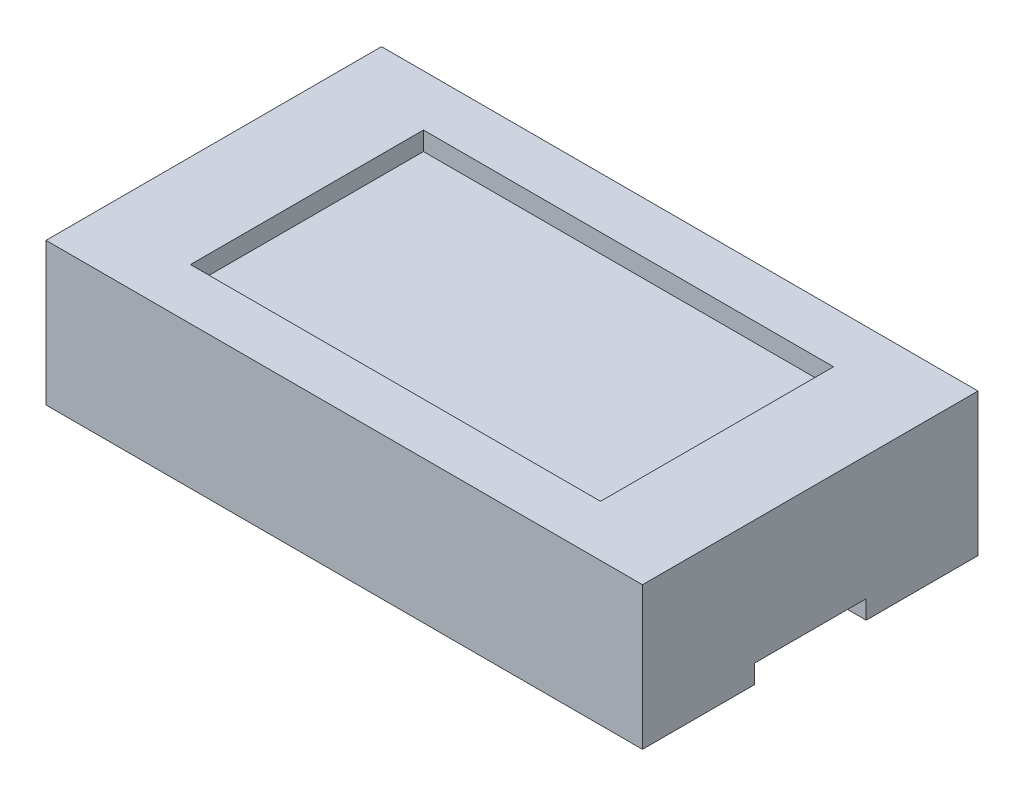
ISO-10303-21;
HEADER;
FILE_DESCRIPTION(('STEP AP214'),'2;1');
FILE_NAME('part.step','',(''),(''),'','','');
FILE_SCHEMA(('AUTOMOTIVE_DESIGN { 1 0 10303 214 1 1 1 1 }'));
ENDSEC;
DATA;
#1=APPLICATION_CONTEXT('core data for automotive mechanical design processes');
#2=APPLICATION_PROTOCOL_DEFINITION('international standard','automotive_design',2000,#1);
#3=PRODUCT_CONTEXT('',#1,'mechanical');
#4=PRODUCT('Part','Part','',(#3));
#5=PRODUCT_RELATED_PRODUCT_CATEGORY('part','',(#4));
#6=PRODUCT_DEFINITION_FORMATION('','',#4);
#7=PRODUCT_DEFINITION_CONTEXT('part definition',#1,'design');
#8=PRODUCT_DEFINITION('design','',#6,#7);
#9=PRODUCT_DEFINITION_SHAPE('','',#8);
#10=(LENGTH_UNIT() NAMED_UNIT(*) SI_UNIT(.MILLI.,.METRE.));
#11=(NAMED_UNIT(*) PLANE_ANGLE_UNIT() SI_UNIT($,.RADIAN.));
#12=(NAMED_UNIT(*) SI_UNIT($,.STERADIAN.) SOLID_ANGLE_UNIT());
#13=UNCERTAINTY_MEASURE_WITH_UNIT(LENGTH_MEASURE(1.E-05),#10,'distance_accuracy_value','');
#14=(GEOMETRIC_REPRESENTATION_CONTEXT(3) GLOBAL_UNCERTAINTY_ASSIGNED_CONTEXT((#13)) GLOBAL_UNIT_ASSIGNED_CONTEXT((#10,
#11,#12)) REPRESENTATION_CONTEXT('',''));
#15=CARTESIAN_POINT('',(0.,0.,0.));
#16=DIRECTION('',(0.,0.,1.));
#17=DIRECTION('',(1.,0.,0.));
#18=AXIS2_PLACEMENT_3D('',#15,#16,#17);
#19=CARTESIAN_POINT('',(32.,15.3,18.));
#20=DIRECTION('',(-1.,0.,0.));
#21=DIRECTION('',(0.,0.,1.));
#22=AXIS2_PLACEMENT_3D('',#19,#20,#21);
#23=PLANE('',#22);
#24=DIRECTION('',(0.,-1.,0.));
#25=VECTOR('',#24,1.);
#26=CARTESIAN_POINT('',(32.,2.,-6.00000000000001));
#27=LINE('',#26,#25);
#28=CARTESIAN_POINT('',(32.,2.,-6.00000000000001));
#29=VERTEX_POINT('',#28);
#30=CARTESIAN_POINT('',(32.,0.,-6.00000000000001));
#31=VERTEX_POINT('',#30);
#32=EDGE_CURVE('E134',#29,#31,#27,.T.);
#33=ORIENTED_EDGE('',*,*,#32,.T.);
#34=DIRECTION('',(0.,0.,-1.));
#35=VECTOR('',#34,1.);
#36=CARTESIAN_POINT('',(32.,0.,18.));
#37=LINE('',#36,#35);
#38=CARTESIAN_POINT('',(32.,0.,-18.));
#39=VERTEX_POINT('',#38);
#40=EDGE_CURVE('E216',#31,#39,#37,.T.);
#41=ORIENTED_EDGE('',*,*,#40,.T.);
#42=DIRECTION('',(0.,-1.,0.));
#43=VECTOR('',#42,1.);
#44=CARTESIAN_POINT('',(32.,15.3,-18.));
#45=LINE('',#44,#43);
#46=CARTESIAN_POINT('',(32.,15.3,-18.));
#47=VERTEX_POINT('',#46);
#48=EDGE_CURVE('E11',#47,#39,#45,.T.);
#49=ORIENTED_EDGE('',*,*,#48,.F.);
#50=DIRECTION('',(0.,0.,-1.));
#51=VECTOR('',#50,1.);
#52=CARTESIAN_POINT('',(32.,15.3,18.));
#53=LINE('',#52,#51);
#54=CARTESIAN_POINT('',(32.,15.3,18.));
#55=VERTEX_POINT('',#54);
#56=EDGE_CURVE('E225',#55,#47,#53,.T.);
#57=ORIENTED_EDGE('',*,*,#56,.F.);
#58=DIRECTION('',(0.,-1.,0.));
#59=VECTOR('',#58,1.);
#60=CARTESIAN_POINT('',(32.,15.3,18.));
#61=LINE('',#60,#59);
#62=CARTESIAN_POINT('',(32.,0.,18.));
#63=VERTEX_POINT('',#62);
#64=EDGE_CURVE('E239',#55,#63,#61,.T.);
#65=ORIENTED_EDGE('',*,*,#64,.T.);
#66=CARTESIAN_POINT('',(32.,0.,6.));
#67=VERTEX_POINT('',#66);
#68=EDGE_CURVE('E240',#63,#67,#37,.T.);
#69=ORIENTED_EDGE('',*,*,#68,.T.);
#70=DIRECTION('',(0.,-1.,0.));
#71=VECTOR('',#70,1.);
#72=CARTESIAN_POINT('',(32.,2.,6.));
#73=LINE('',#72,#71);
#74=CARTESIAN_POINT('',(32.,2.,6.));
#75=VERTEX_POINT('',#74);
#76=EDGE_CURVE('E60',#75,#67,#73,.T.);
#77=ORIENTED_EDGE('',*,*,#76,.F.);
#78=DIRECTION('',(0.,0.,1.));
#79=VECTOR('',#78,1.);
#80=CARTESIAN_POINT('',(32.,2.,0.));
#81=LINE('',#80,#79);
#82=EDGE_CURVE('E152',#29,#75,#81,.T.);
#83=ORIENTED_EDGE('',*,*,#82,.F.);
#84=EDGE_LOOP('',(#33,#41,#49,#57,#65,#69,#77,#83));
#85=FACE_BOUND('',#84,.T.);
#86=ADVANCED_FACE('F45',(#85),#23,.F.);
#87=CARTESIAN_POINT('',(0.,0.,0.));
#88=DIRECTION('',(0.,-1.,0.));
#89=DIRECTION('',(0.,0.,-1.));
#90=AXIS2_PLACEMENT_3D('',#87,#88,#89);
#91=PLANE('',#90);
#92=ORIENTED_EDGE('',*,*,#40,.F.);
#93=DIRECTION('',(-1.,0.,0.));
#94=VECTOR('',#93,1.);
#95=CARTESIAN_POINT('',(0.,0.,-6.));
#96=LINE('',#95,#94);
#97=CARTESIAN_POINT('',(16.,0.,-6.));
#98=VERTEX_POINT('',#97);
#99=EDGE_CURVE('E140',#31,#98,#96,.T.);
#100=ORIENTED_EDGE('',*,*,#99,.T.);
#101=DIRECTION('',(0.,0.,-1.));
#102=VECTOR('',#101,1.);
#103=CARTESIAN_POINT('',(16.,0.,0.));
#104=LINE('',#103,#102);
#105=CARTESIAN_POINT('',(16.,0.,6.));
#106=VERTEX_POINT('',#105);
#107=EDGE_CURVE('E155',#106,#98,#104,.T.);
#108=ORIENTED_EDGE('',*,*,#107,.F.);
#109=DIRECTION('',(-1.,0.,0.));
#110=VECTOR('',#109,1.);
#111=CARTESIAN_POINT('',(0.,0.,6.));
#112=LINE('',#111,#110);
#113=EDGE_CURVE('E168',#67,#106,#112,.T.);
#114=ORIENTED_EDGE('',*,*,#113,.F.);
#115=ORIENTED_EDGE('',*,*,#68,.F.);
#116=DIRECTION('',(1.,0.,0.));
#117=VECTOR('',#116,1.);
#118=CARTESIAN_POINT('',(-32.,0.,18.));
#119=LINE('',#118,#117);
#120=CARTESIAN_POINT('',(-32.,0.,18.));
#121=VERTEX_POINT('',#120);
#122=EDGE_CURVE('E230',#121,#63,#119,.T.);
#123=ORIENTED_EDGE('',*,*,#122,.F.);
#124=DIRECTION('',(0.,0.,1.));
#125=VECTOR('',#124,1.);
#126=CARTESIAN_POINT('',(-32.,0.,18.));
#127=LINE('',#126,#125);
#128=CARTESIAN_POINT('',(-32.,0.,-18.));
#129=VERTEX_POINT('',#128);
#130=EDGE_CURVE('E246',#129,#121,#127,.T.);
#131=ORIENTED_EDGE('',*,*,#130,.F.);
#132=DIRECTION('',(-1.,0.,0.));
#133=VECTOR('',#132,1.);
#134=CARTESIAN_POINT('',(-32.,0.,-18.));
#135=LINE('',#134,#133);
#136=EDGE_CURVE('E243',#39,#129,#135,.T.);
#137=ORIENTED_EDGE('',*,*,#136,.F.);
#138=EDGE_LOOP('',(#92,#100,#108,#114,#115,#123,#131,#137));
#139=FACE_BOUND('',#138,.T.);
#140=ADVANCED_FACE('F269',(#139),#91,.T.);
#141=CARTESIAN_POINT('',(-32.,15.3,-18.));
#142=DIRECTION('',(0.,0.,1.));
#143=DIRECTION('',(1.,0.,0.));
#144=AXIS2_PLACEMENT_3D('',#141,#142,#143);
#145=PLANE('',#144);
#146=ORIENTED_EDGE('',*,*,#136,.T.);
#147=DIRECTION('',(0.,-1.,0.));
#148=VECTOR('',#147,1.);
#149=CARTESIAN_POINT('',(-32.,15.3,-18.));
#150=LINE('',#149,#148);
#151=CARTESIAN_POINT('',(-32.,15.3,-18.));
#152=VERTEX_POINT('',#151);
#153=EDGE_CURVE('E53',#152,#129,#150,.T.);
#154=ORIENTED_EDGE('',*,*,#153,.F.);
#155=DIRECTION('',(-1.,0.,0.));
#156=VECTOR('',#155,1.);
#157=CARTESIAN_POINT('',(-32.,15.3,-18.));
#158=LINE('',#157,#156);
#159=EDGE_CURVE('E229',#47,#152,#158,.T.);
#160=ORIENTED_EDGE('',*,*,#159,.F.);
#161=ORIENTED_EDGE('',*,*,#48,.T.);
#162=EDGE_LOOP('',(#146,#154,#160,#161));
#163=FACE_BOUND('',#162,.T.);
#164=ADVANCED_FACE('F279',(#163),#145,.F.);
#165=CARTESIAN_POINT('',(-32.,15.3,18.));
#166=DIRECTION('',(1.,0.,0.));
#167=DIRECTION('',(0.,0.,-1.));
#168=AXIS2_PLACEMENT_3D('',#165,#166,#167);
#169=PLANE('',#168);
#170=ORIENTED_EDGE('',*,*,#130,.T.);
#171=DIRECTION('',(0.,-1.,0.));
#172=VECTOR('',#171,1.);
#173=CARTESIAN_POINT('',(-32.,15.3,18.));
#174=LINE('',#173,#172);
#175=CARTESIAN_POINT('',(-32.,15.3,18.));
#176=VERTEX_POINT('',#175);
#177=EDGE_CURVE('E254',#176,#121,#174,.T.);
#178=ORIENTED_EDGE('',*,*,#177,.F.);
#179=DIRECTION('',(0.,0.,1.));
#180=VECTOR('',#179,1.);
#181=CARTESIAN_POINT('',(-32.,15.3,18.));
#182=LINE('',#181,#180);
#183=EDGE_CURVE('E233',#152,#176,#182,.T.);
#184=ORIENTED_EDGE('',*,*,#183,.F.);
#185=ORIENTED_EDGE('',*,*,#153,.T.);
#186=EDGE_LOOP('',(#170,#178,#184,#185));
#187=FACE_BOUND('',#186,.T.);
#188=ADVANCED_FACE('F263',(#187),#169,.F.);
#189=CARTESIAN_POINT('',(-32.,15.3,18.));
#190=DIRECTION('',(0.,0.,-1.));
#191=DIRECTION('',(-1.,0.,0.));
#192=AXIS2_PLACEMENT_3D('',#189,#190,#191);
#193=PLANE('',#192);
#194=ORIENTED_EDGE('',*,*,#122,.T.);
#195=ORIENTED_EDGE('',*,*,#64,.F.);
#196=DIRECTION('',(1.,0.,0.));
#197=VECTOR('',#196,1.);
#198=CARTESIAN_POINT('',(-32.,15.3,18.));
#199=LINE('',#198,#197);
#200=EDGE_CURVE('E236',#176,#55,#199,.T.);
#201=ORIENTED_EDGE('',*,*,#200,.F.);
#202=ORIENTED_EDGE('',*,*,#177,.T.);
#203=EDGE_LOOP('',(#194,#195,#201,#202));
#204=FACE_BOUND('',#203,.T.);
#205=ADVANCED_FACE('F273',(#204),#193,.F.);
#206=CARTESIAN_POINT('',(0.,15.3,0.));
#207=DIRECTION('',(0.,-1.,0.));
#208=DIRECTION('',(0.,0.,-1.));
#209=AXIS2_PLACEMENT_3D('',#206,#207,#208);
#210=PLANE('',#209);
#211=DIRECTION('',(-1.,0.,0.));
#212=VECTOR('',#211,1.);
#213=CARTESIAN_POINT('',(-22.,15.3,-12.5));
#214=LINE('',#213,#212);
#215=CARTESIAN_POINT('',(22.,15.3,-12.5));
#216=VERTEX_POINT('',#215);
#217=CARTESIAN_POINT('',(-22.,15.3,-12.5));
#218=VERTEX_POINT('',#217);
#219=EDGE_CURVE('E202',#216,#218,#214,.T.);
#220=ORIENTED_EDGE('',*,*,#219,.F.);
#221=DIRECTION('',(0.,0.,-1.));
#222=VECTOR('',#221,1.);
#223=CARTESIAN_POINT('',(22.,15.3,12.5));
#224=LINE('',#223,#222);
#225=CARTESIAN_POINT('',(22.,15.3,12.5));
#226=VERTEX_POINT('',#225);
#227=EDGE_CURVE('E68',#226,#216,#224,.T.);
#228=ORIENTED_EDGE('',*,*,#227,.F.);
#229=DIRECTION('',(1.,0.,0.));
#230=VECTOR('',#229,1.);
#231=CARTESIAN_POINT('',(-22.,15.3,12.5));
#232=LINE('',#231,#230);
#233=CARTESIAN_POINT('',(-22.,15.3,12.5));
#234=VERTEX_POINT('',#233);
#235=EDGE_CURVE('E187',#234,#226,#232,.T.);
#236=ORIENTED_EDGE('',*,*,#235,.F.);
#237=DIRECTION('',(0.,0.,1.));
#238=VECTOR('',#237,1.);
#239=CARTESIAN_POINT('',(-22.,15.3,12.5));
#240=LINE('',#239,#238);
#241=EDGE_CURVE('E206',#218,#234,#240,.T.);
#242=ORIENTED_EDGE('',*,*,#241,.F.);
#243=EDGE_LOOP('',(#220,#228,#236,#242));
#244=FACE_BOUND('',#243,.T.);
#245=ORIENTED_EDGE('',*,*,#56,.T.);
#246=ORIENTED_EDGE('',*,*,#159,.T.);
#247=ORIENTED_EDGE('',*,*,#183,.T.);
#248=ORIENTED_EDGE('',*,*,#200,.T.);
#249=EDGE_LOOP('',(#245,#246,#247,#248));
#250=FACE_BOUND('',#249,.T.);
#251=ADVANCED_FACE('F278',(#244,#250),#210,.F.);
#252=CARTESIAN_POINT('',(22.,13.3,12.5));
#253=DIRECTION('',(1.,0.,0.));
#254=DIRECTION('',(0.,0.,-1.));
#255=AXIS2_PLACEMENT_3D('',#252,#253,#254);
#256=PLANE('',#255);
#257=ORIENTED_EDGE('',*,*,#227,.T.);
#258=DIRECTION('',(0.,1.,0.));
#259=VECTOR('',#258,1.);
#260=CARTESIAN_POINT('',(22.,13.3,-12.5));
#261=LINE('',#260,#259);
#262=CARTESIAN_POINT('',(22.,13.3,-12.5));
#263=VERTEX_POINT('',#262);
#264=EDGE_CURVE('E199',#263,#216,#261,.T.);
#265=ORIENTED_EDGE('',*,*,#264,.F.);
#266=DIRECTION('',(0.,0.,-1.));
#267=VECTOR('',#266,1.);
#268=CARTESIAN_POINT('',(22.,13.3,12.5));
#269=LINE('',#268,#267);
#270=CARTESIAN_POINT('',(22.,13.3,12.5));
#271=VERTEX_POINT('',#270);
#272=EDGE_CURVE('E182',#271,#263,#269,.T.);
#273=ORIENTED_EDGE('',*,*,#272,.F.);
#274=DIRECTION('',(0.,1.,0.));
#275=VECTOR('',#274,1.);
#276=CARTESIAN_POINT('',(22.,13.3,12.5));
#277=LINE('',#276,#275);
#278=EDGE_CURVE('E213',#271,#226,#277,.T.);
#279=ORIENTED_EDGE('',*,*,#278,.T.);
#280=EDGE_LOOP('',(#257,#265,#273,#279));
#281=FACE_BOUND('',#280,.T.);
#282=ADVANCED_FACE('F391',(#281),#256,.F.);
#283=CARTESIAN_POINT('',(-22.,13.3,12.5));
#284=DIRECTION('',(0.,0.,1.));
#285=DIRECTION('',(1.,0.,0.));
#286=AXIS2_PLACEMENT_3D('',#283,#284,#285);
#287=PLANE('',#286);
#288=ORIENTED_EDGE('',*,*,#235,.T.);
#289=ORIENTED_EDGE('',*,*,#278,.F.);
#290=DIRECTION('',(1.,0.,0.));
#291=VECTOR('',#290,1.);
#292=CARTESIAN_POINT('',(-22.,13.3,12.5));
#293=LINE('',#292,#291);
#294=CARTESIAN_POINT('',(-22.,13.3,12.5));
#295=VERTEX_POINT('',#294);
#296=EDGE_CURVE('E195',#295,#271,#293,.T.);
#297=ORIENTED_EDGE('',*,*,#296,.F.);
#298=DIRECTION('',(0.,1.,0.));
#299=VECTOR('',#298,1.);
#300=CARTESIAN_POINT('',(-22.,13.3,12.5));
#301=LINE('',#300,#299);
#302=EDGE_CURVE('E217',#295,#234,#301,.T.);
#303=ORIENTED_EDGE('',*,*,#302,.T.);
#304=EDGE_LOOP('',(#288,#289,#297,#303));
#305=FACE_BOUND('',#304,.T.);
#306=ADVANCED_FACE('F380',(#305),#287,.F.);
#307=CARTESIAN_POINT('',(-22.,13.3,12.5));
#308=DIRECTION('',(-1.,0.,0.));
#309=DIRECTION('',(0.,0.,1.));
#310=AXIS2_PLACEMENT_3D('',#307,#308,#309);
#311=PLANE('',#310);
#312=ORIENTED_EDGE('',*,*,#241,.T.);
#313=ORIENTED_EDGE('',*,*,#302,.F.);
#314=DIRECTION('',(0.,0.,1.));
#315=VECTOR('',#314,1.);
#316=CARTESIAN_POINT('',(-22.,13.3,12.5));
#317=LINE('',#316,#315);
#318=CARTESIAN_POINT('',(-22.,13.3,-12.5));
#319=VERTEX_POINT('',#318);
#320=EDGE_CURVE('E191',#319,#295,#317,.T.);
#321=ORIENTED_EDGE('',*,*,#320,.F.);
#322=DIRECTION('',(0.,1.,0.));
#323=VECTOR('',#322,1.);
#324=CARTESIAN_POINT('',(-22.,13.3,-12.5));
#325=LINE('',#324,#323);
#326=EDGE_CURVE('E220',#319,#218,#325,.T.);
#327=ORIENTED_EDGE('',*,*,#326,.T.);
#328=EDGE_LOOP('',(#312,#313,#321,#327));
#329=FACE_BOUND('',#328,.T.);
#330=ADVANCED_FACE('F369',(#329),#311,.F.);
#331=CARTESIAN_POINT('',(-22.,13.3,-12.5));
#332=DIRECTION('',(0.,0.,-1.));
#333=DIRECTION('',(-1.,0.,0.));
#334=AXIS2_PLACEMENT_3D('',#331,#332,#333);
#335=PLANE('',#334);
#336=ORIENTED_EDGE('',*,*,#219,.T.);
#337=ORIENTED_EDGE('',*,*,#326,.F.);
#338=DIRECTION('',(-1.,0.,0.));
#339=VECTOR('',#338,1.);
#340=CARTESIAN_POINT('',(-22.,13.3,-12.5));
#341=LINE('',#340,#339);
#342=EDGE_CURVE('E186',#263,#319,#341,.T.);
#343=ORIENTED_EDGE('',*,*,#342,.F.);
#344=ORIENTED_EDGE('',*,*,#264,.T.);
#345=EDGE_LOOP('',(#336,#337,#343,#344));
#346=FACE_BOUND('',#345,.T.);
#347=ADVANCED_FACE('F358',(#346),#335,.F.);
#348=CARTESIAN_POINT('',(0.,13.3,0.));
#349=DIRECTION('',(0.,-1.,0.));
#350=DIRECTION('',(0.,0.,-1.));
#351=AXIS2_PLACEMENT_3D('',#348,#349,#350);
#352=PLANE('',#351);
#353=ORIENTED_EDGE('',*,*,#272,.T.);
#354=ORIENTED_EDGE('',*,*,#342,.T.);
#355=ORIENTED_EDGE('',*,*,#320,.T.);
#356=ORIENTED_EDGE('',*,*,#296,.T.);
#357=EDGE_LOOP('',(#353,#354,#355,#356));
#358=FACE_BOUND('',#357,.T.);
#359=ADVANCED_FACE('F306',(#358),#352,.F.);
#360=CARTESIAN_POINT('',(0.,2.,-6.));
#361=DIRECTION('',(0.,0.,1.));
#362=DIRECTION('',(1.,0.,0.));
#363=AXIS2_PLACEMENT_3D('',#360,#361,#362);
#364=PLANE('',#363);
#365=ORIENTED_EDGE('',*,*,#99,.F.);
#366=ORIENTED_EDGE('',*,*,#32,.F.);
#367=DIRECTION('',(-1.,0.,0.));
#368=VECTOR('',#367,1.);
#369=CARTESIAN_POINT('',(0.,2.,-6.));
#370=LINE('',#369,#368);
#371=CARTESIAN_POINT('',(16.,2.,-6.));
#372=VERTEX_POINT('',#371);
#373=EDGE_CURVE('E137',#29,#372,#370,.T.);
#374=ORIENTED_EDGE('',*,*,#373,.T.);
#375=DIRECTION('',(0.,-1.,0.));
#376=VECTOR('',#375,1.);
#377=CARTESIAN_POINT('',(16.,2.,-6.));
#378=LINE('',#377,#376);
#379=EDGE_CURVE('E174',#372,#98,#378,.T.);
#380=ORIENTED_EDGE('',*,*,#379,.T.);
#381=EDGE_LOOP('',(#365,#366,#374,#380));
#382=FACE_BOUND('',#381,.T.);
#383=ADVANCED_FACE('F136',(#382),#364,.T.);
#384=CARTESIAN_POINT('',(16.,2.,0.));
#385=DIRECTION('',(-1.,0.,0.));
#386=DIRECTION('',(0.,0.,1.));
#387=AXIS2_PLACEMENT_3D('',#384,#385,#386);
#388=PLANE('',#387);
#389=ORIENTED_EDGE('',*,*,#107,.T.);
#390=ORIENTED_EDGE('',*,*,#379,.F.);
#391=DIRECTION('',(0.,0.,-1.));
#392=VECTOR('',#391,1.);
#393=CARTESIAN_POINT('',(16.,2.,0.));
#394=LINE('',#393,#392);
#395=CARTESIAN_POINT('',(16.,2.,6.));
#396=VERTEX_POINT('',#395);
#397=EDGE_CURVE('E145',#396,#372,#394,.T.);
#398=ORIENTED_EDGE('',*,*,#397,.F.);
#399=DIRECTION('',(0.,-1.,0.));
#400=VECTOR('',#399,1.);
#401=CARTESIAN_POINT('',(16.,2.,6.));
#402=LINE('',#401,#400);
#403=EDGE_CURVE('E177',#396,#106,#402,.T.);
#404=ORIENTED_EDGE('',*,*,#403,.T.);
#405=EDGE_LOOP('',(#389,#390,#398,#404));
#406=FACE_BOUND('',#405,.T.);
#407=ADVANCED_FACE('F305',(#406),#388,.F.);
#408=CARTESIAN_POINT('',(0.,2.,6.));
#409=DIRECTION('',(0.,0.,1.));
#410=DIRECTION('',(1.,0.,0.));
#411=AXIS2_PLACEMENT_3D('',#408,#409,#410);
#412=PLANE('',#411);
#413=ORIENTED_EDGE('',*,*,#113,.T.);
#414=ORIENTED_EDGE('',*,*,#403,.F.);
#415=DIRECTION('',(-1.,0.,0.));
#416=VECTOR('',#415,1.);
#417=CARTESIAN_POINT('',(0.,2.,6.));
#418=LINE('',#417,#416);
#419=EDGE_CURVE('E159',#75,#396,#418,.T.);
#420=ORIENTED_EDGE('',*,*,#419,.F.);
#421=ORIENTED_EDGE('',*,*,#76,.T.);
#422=EDGE_LOOP('',(#413,#414,#420,#421));
#423=FACE_BOUND('',#422,.T.);
#424=ADVANCED_FACE('F318',(#423),#412,.F.);
#425=CARTESIAN_POINT('',(0.,2.,0.));
#426=DIRECTION('',(0.,-1.,0.));
#427=DIRECTION('',(0.,0.,-1.));
#428=AXIS2_PLACEMENT_3D('',#425,#426,#427);
#429=PLANE('',#428);
#430=ORIENTED_EDGE('',*,*,#373,.F.);
#431=ORIENTED_EDGE('',*,*,#82,.T.);
#432=ORIENTED_EDGE('',*,*,#419,.T.);
#433=ORIENTED_EDGE('',*,*,#397,.T.);
#434=EDGE_LOOP('',(#430,#431,#432,#433));
#435=FACE_BOUND('',#434,.T.);
#436=ADVANCED_FACE('F150',(#435),#429,.T.);
#437=CLOSED_SHELL('',(#86,#140,#164,#188,#205,#251,#282,#306,#330,#347,#359,#383,#407,#424,#436));
#438=MANIFOLD_SOLID_BREP('B2',#437);
#439=ADVANCED_BREP_SHAPE_REPRESENTATION('',(#18,#438),#14);
#440=SHAPE_DEFINITION_REPRESENTATION(#9,#439);
ENDSEC;
END-ISO-10303-21;
